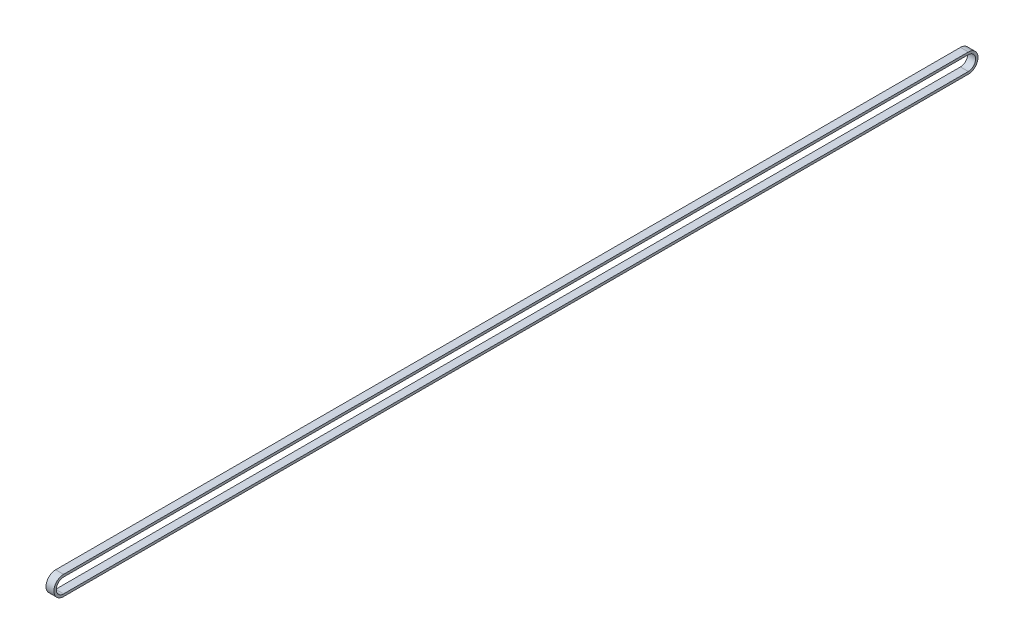
ISO-10303-21;
HEADER;
FILE_DESCRIPTION(('STEP AP214'),'2;1');
FILE_NAME('part.step','',(''),(''),'','','');
FILE_SCHEMA(('AUTOMOTIVE_DESIGN { 1 0 10303 214 1 1 1 1 }'));
ENDSEC;
DATA;
#1=APPLICATION_CONTEXT('core data for automotive mechanical design processes');
#2=APPLICATION_PROTOCOL_DEFINITION('international standard','automotive_design',2000,#1);
#3=PRODUCT_CONTEXT('',#1,'mechanical');
#4=PRODUCT('Part','Part','',(#3));
#5=PRODUCT_RELATED_PRODUCT_CATEGORY('part','',(#4));
#6=PRODUCT_DEFINITION_FORMATION('','',#4);
#7=PRODUCT_DEFINITION_CONTEXT('part definition',#1,'design');
#8=PRODUCT_DEFINITION('design','',#6,#7);
#9=PRODUCT_DEFINITION_SHAPE('','',#8);
#10=(LENGTH_UNIT() NAMED_UNIT(*) SI_UNIT(.MILLI.,.METRE.));
#11=(NAMED_UNIT(*) PLANE_ANGLE_UNIT() SI_UNIT($,.RADIAN.));
#12=(NAMED_UNIT(*) SI_UNIT($,.STERADIAN.) SOLID_ANGLE_UNIT());
#13=UNCERTAINTY_MEASURE_WITH_UNIT(LENGTH_MEASURE(1.E-05),#10,'distance_accuracy_value','');
#14=(GEOMETRIC_REPRESENTATION_CONTEXT(3) GLOBAL_UNCERTAINTY_ASSIGNED_CONTEXT((#13)) GLOBAL_UNIT_ASSIGNED_CONTEXT((#10,
#11,#12)) REPRESENTATION_CONTEXT('',''));
#15=CARTESIAN_POINT('',(0.,0.,0.));
#16=DIRECTION('',(0.,0.,1.));
#17=DIRECTION('',(1.,0.,0.));
#18=AXIS2_PLACEMENT_3D('',#15,#16,#17);
#19=CARTESIAN_POINT('',(10.,9.17000000000001,0.));
#20=DIRECTION('',(-1.,0.,0.));
#21=DIRECTION('',(0.,0.,1.));
#22=AXIS2_PLACEMENT_3D('',#19,#20,#21);
#23=PLANE('',#22);
#24=CARTESIAN_POINT('',(10.,9.17000000000001,0.));
#25=DIRECTION('',(1.,0.,0.));
#26=DIRECTION('',(0.,0.,1.));
#27=AXIS2_PLACEMENT_3D('',#24,#25,#26);
#28=CIRCLE('',#27,12.17);
#29=CARTESIAN_POINT('',(10.,21.34,0.));
#30=VERTEX_POINT('',#29);
#31=CARTESIAN_POINT('',(10.,-3.,0.));
#32=VERTEX_POINT('',#31);
#33=EDGE_CURVE('E157',#30,#32,#28,.T.);
#34=ORIENTED_EDGE('',*,*,#33,.T.);
#35=DIRECTION('',(0.,0.,-1.));
#36=VECTOR('',#35,1.);
#37=CARTESIAN_POINT('',(10.,-3.,0.));
#38=LINE('',#37,#36);
#39=CARTESIAN_POINT('',(10.,-3.,-1141.));
#40=VERTEX_POINT('',#39);
#41=EDGE_CURVE('E161',#32,#40,#38,.T.);
#42=ORIENTED_EDGE('',*,*,#41,.T.);
#43=CARTESIAN_POINT('',(10.,9.17000000000001,-1141.));
#44=DIRECTION('',(1.,0.,0.));
#45=DIRECTION('',(0.,0.,-1.));
#46=AXIS2_PLACEMENT_3D('',#43,#44,#45);
#47=CIRCLE('',#46,12.17);
#48=CARTESIAN_POINT('',(10.,21.34,-1141.));
#49=VERTEX_POINT('',#48);
#50=EDGE_CURVE('E165',#40,#49,#47,.T.);
#51=ORIENTED_EDGE('',*,*,#50,.T.);
#52=DIRECTION('',(0.,0.,1.));
#53=VECTOR('',#52,1.);
#54=CARTESIAN_POINT('',(10.,21.34,0.));
#55=LINE('',#54,#53);
#56=EDGE_CURVE('E168',#49,#30,#55,.T.);
#57=ORIENTED_EDGE('',*,*,#56,.T.);
#58=EDGE_LOOP('',(#34,#42,#51,#57));
#59=FACE_BOUND('',#58,.T.);
#60=CARTESIAN_POINT('',(10.,9.17000000000001,0.));
#61=DIRECTION('',(1.,0.,0.));
#62=DIRECTION('',(0.,0.,1.));
#63=AXIS2_PLACEMENT_3D('',#60,#61,#62);
#64=CIRCLE('',#63,9.17000000000001);
#65=CARTESIAN_POINT('',(10.,18.34,0.));
#66=VERTEX_POINT('',#65);
#67=CARTESIAN_POINT('',(10.,0.,0.));
#68=VERTEX_POINT('',#67);
#69=EDGE_CURVE('E109',#66,#68,#64,.T.);
#70=ORIENTED_EDGE('',*,*,#69,.F.);
#71=DIRECTION('',(0.,0.,1.));
#72=VECTOR('',#71,1.);
#73=CARTESIAN_POINT('',(10.,18.34,0.));
#74=LINE('',#73,#72);
#75=CARTESIAN_POINT('',(10.,18.34,-1141.));
#76=VERTEX_POINT('',#75);
#77=EDGE_CURVE('E135',#76,#66,#74,.T.);
#78=ORIENTED_EDGE('',*,*,#77,.F.);
#79=CARTESIAN_POINT('',(10.,9.17000000000001,-1141.));
#80=DIRECTION('',(1.,0.,0.));
#81=DIRECTION('',(0.,0.,-1.));
#82=AXIS2_PLACEMENT_3D('',#79,#80,#81);
#83=CIRCLE('',#82,9.17000000000001);
#84=CARTESIAN_POINT('',(10.,0.,-1141.));
#85=VERTEX_POINT('',#84);
#86=EDGE_CURVE('E131',#85,#76,#83,.T.);
#87=ORIENTED_EDGE('',*,*,#86,.F.);
#88=DIRECTION('',(0.,0.,-1.));
#89=VECTOR('',#88,1.);
#90=CARTESIAN_POINT('',(10.,0.,0.));
#91=LINE('',#90,#89);
#92=EDGE_CURVE('E118',#68,#85,#91,.T.);
#93=ORIENTED_EDGE('',*,*,#92,.F.);
#94=EDGE_LOOP('',(#70,#78,#87,#93));
#95=FACE_BOUND('',#94,.T.);
#96=ADVANCED_FACE('F43',(#59,#95),#23,.F.);
#97=CARTESIAN_POINT('',(0.,9.17000000000001,0.));
#98=DIRECTION('',(-1.,0.,0.));
#99=DIRECTION('',(0.,0.,1.));
#100=AXIS2_PLACEMENT_3D('',#97,#98,#99);
#101=PLANE('',#100);
#102=CARTESIAN_POINT('',(0.,9.17000000000001,0.));
#103=DIRECTION('',(1.,0.,0.));
#104=DIRECTION('',(0.,0.,1.));
#105=AXIS2_PLACEMENT_3D('',#102,#103,#104);
#106=CIRCLE('',#105,12.17);
#107=CARTESIAN_POINT('',(0.,21.34,0.));
#108=VERTEX_POINT('',#107);
#109=CARTESIAN_POINT('',(0.,-3.,0.));
#110=VERTEX_POINT('',#109);
#111=EDGE_CURVE('E127',#108,#110,#106,.T.);
#112=ORIENTED_EDGE('',*,*,#111,.F.);
#113=DIRECTION('',(0.,0.,1.));
#114=VECTOR('',#113,1.);
#115=CARTESIAN_POINT('',(0.,21.34,0.));
#116=LINE('',#115,#114);
#117=CARTESIAN_POINT('',(0.,21.34,-1141.));
#118=VERTEX_POINT('',#117);
#119=EDGE_CURVE('E162',#118,#108,#116,.T.);
#120=ORIENTED_EDGE('',*,*,#119,.F.);
#121=CARTESIAN_POINT('',(0.,9.17000000000001,-1141.));
#122=DIRECTION('',(1.,0.,0.));
#123=DIRECTION('',(0.,0.,-1.));
#124=AXIS2_PLACEMENT_3D('',#121,#122,#123);
#125=CIRCLE('',#124,12.17);
#126=CARTESIAN_POINT('',(0.,-3.,-1141.));
#127=VERTEX_POINT('',#126);
#128=EDGE_CURVE('E178',#127,#118,#125,.T.);
#129=ORIENTED_EDGE('',*,*,#128,.F.);
#130=DIRECTION('',(0.,0.,-1.));
#131=VECTOR('',#130,1.);
#132=CARTESIAN_POINT('',(0.,-3.,0.));
#133=LINE('',#132,#131);
#134=EDGE_CURVE('E175',#110,#127,#133,.T.);
#135=ORIENTED_EDGE('',*,*,#134,.F.);
#136=EDGE_LOOP('',(#112,#120,#129,#135));
#137=FACE_BOUND('',#136,.T.);
#138=DIRECTION('',(0.,0.,1.));
#139=VECTOR('',#138,1.);
#140=CARTESIAN_POINT('',(0.,18.34,0.));
#141=LINE('',#140,#139);
#142=CARTESIAN_POINT('',(0.,18.34,-1141.));
#143=VERTEX_POINT('',#142);
#144=CARTESIAN_POINT('',(0.,18.34,0.));
#145=VERTEX_POINT('',#144);
#146=EDGE_CURVE('E119',#143,#145,#141,.T.);
#147=ORIENTED_EDGE('',*,*,#146,.T.);
#148=CARTESIAN_POINT('',(0.,9.17000000000001,0.));
#149=DIRECTION('',(1.,0.,0.));
#150=DIRECTION('',(0.,0.,1.));
#151=AXIS2_PLACEMENT_3D('',#148,#149,#150);
#152=CIRCLE('',#151,9.17000000000001);
#153=CARTESIAN_POINT('',(0.,0.,0.));
#154=VERTEX_POINT('',#153);
#155=EDGE_CURVE('E67',#145,#154,#152,.T.);
#156=ORIENTED_EDGE('',*,*,#155,.T.);
#157=DIRECTION('',(0.,0.,-1.));
#158=VECTOR('',#157,1.);
#159=CARTESIAN_POINT('',(0.,0.,0.));
#160=LINE('',#159,#158);
#161=CARTESIAN_POINT('',(0.,0.,-1141.));
#162=VERTEX_POINT('',#161);
#163=EDGE_CURVE('E125',#154,#162,#160,.T.);
#164=ORIENTED_EDGE('',*,*,#163,.T.);
#165=CARTESIAN_POINT('',(0.,9.17000000000001,-1141.));
#166=DIRECTION('',(1.,0.,0.));
#167=DIRECTION('',(0.,0.,-1.));
#168=AXIS2_PLACEMENT_3D('',#165,#166,#167);
#169=CIRCLE('',#168,9.17000000000001);
#170=EDGE_CURVE('E144',#162,#143,#169,.T.);
#171=ORIENTED_EDGE('',*,*,#170,.T.);
#172=EDGE_LOOP('',(#147,#156,#164,#171));
#173=FACE_BOUND('',#172,.T.);
#174=ADVANCED_FACE('F201',(#137,#173),#101,.T.);
#175=CARTESIAN_POINT('',(10.,9.17000000000001,0.));
#176=DIRECTION('',(-1.,0.,0.));
#177=DIRECTION('',(0.,0.,1.));
#178=AXIS2_PLACEMENT_3D('',#175,#176,#177);
#179=CYLINDRICAL_SURFACE('',#178,12.17);
#180=ORIENTED_EDGE('',*,*,#111,.T.);
#181=DIRECTION('',(-1.,0.,0.));
#182=VECTOR('',#181,1.);
#183=CARTESIAN_POINT('',(10.,-3.,0.));
#184=LINE('',#183,#182);
#185=EDGE_CURVE('E11',#32,#110,#184,.T.);
#186=ORIENTED_EDGE('',*,*,#185,.F.);
#187=ORIENTED_EDGE('',*,*,#33,.F.);
#188=DIRECTION('',(-1.,0.,0.));
#189=VECTOR('',#188,1.);
#190=CARTESIAN_POINT('',(10.,21.34,0.));
#191=LINE('',#190,#189);
#192=EDGE_CURVE('E171',#30,#108,#191,.T.);
#193=ORIENTED_EDGE('',*,*,#192,.T.);
#194=EDGE_LOOP('',(#180,#186,#187,#193));
#195=FACE_BOUND('',#194,.T.);
#196=ADVANCED_FACE('F45',(#195),#179,.T.);
#197=CARTESIAN_POINT('',(10.,-3.,0.));
#198=DIRECTION('',(0.,1.,0.));
#199=DIRECTION('',(0.,0.,1.));
#200=AXIS2_PLACEMENT_3D('',#197,#198,#199);
#201=PLANE('',#200);
#202=ORIENTED_EDGE('',*,*,#134,.T.);
#203=DIRECTION('',(-1.,0.,0.));
#204=VECTOR('',#203,1.);
#205=CARTESIAN_POINT('',(10.,-3.,-1141.));
#206=LINE('',#205,#204);
#207=EDGE_CURVE('E52',#40,#127,#206,.T.);
#208=ORIENTED_EDGE('',*,*,#207,.F.);
#209=ORIENTED_EDGE('',*,*,#41,.F.);
#210=ORIENTED_EDGE('',*,*,#185,.T.);
#211=EDGE_LOOP('',(#202,#208,#209,#210));
#212=FACE_BOUND('',#211,.T.);
#213=ADVANCED_FACE('F211',(#212),#201,.F.);
#214=CARTESIAN_POINT('',(10.,9.17000000000001,-1141.));
#215=DIRECTION('',(-1.,0.,0.));
#216=DIRECTION('',(0.,0.,1.));
#217=AXIS2_PLACEMENT_3D('',#214,#215,#216);
#218=CYLINDRICAL_SURFACE('',#217,12.17);
#219=ORIENTED_EDGE('',*,*,#128,.T.);
#220=DIRECTION('',(-1.,0.,0.));
#221=VECTOR('',#220,1.);
#222=CARTESIAN_POINT('',(10.,21.34,-1141.));
#223=LINE('',#222,#221);
#224=EDGE_CURVE('E186',#49,#118,#223,.T.);
#225=ORIENTED_EDGE('',*,*,#224,.F.);
#226=ORIENTED_EDGE('',*,*,#50,.F.);
#227=ORIENTED_EDGE('',*,*,#207,.T.);
#228=EDGE_LOOP('',(#219,#225,#226,#227));
#229=FACE_BOUND('',#228,.T.);
#230=ADVANCED_FACE('F195',(#229),#218,.T.);
#231=CARTESIAN_POINT('',(10.,21.34,0.));
#232=DIRECTION('',(0.,-1.,0.));
#233=DIRECTION('',(0.,0.,-1.));
#234=AXIS2_PLACEMENT_3D('',#231,#232,#233);
#235=PLANE('',#234);
#236=ORIENTED_EDGE('',*,*,#119,.T.);
#237=ORIENTED_EDGE('',*,*,#192,.F.);
#238=ORIENTED_EDGE('',*,*,#56,.F.);
#239=ORIENTED_EDGE('',*,*,#224,.T.);
#240=EDGE_LOOP('',(#236,#237,#238,#239));
#241=FACE_BOUND('',#240,.T.);
#242=ADVANCED_FACE('F205',(#241),#235,.F.);
#243=CARTESIAN_POINT('',(10.,9.17000000000001,0.));
#244=DIRECTION('',(-1.,0.,0.));
#245=DIRECTION('',(0.,0.,1.));
#246=AXIS2_PLACEMENT_3D('',#243,#244,#245);
#247=CYLINDRICAL_SURFACE('',#246,9.17000000000001);
#248=ORIENTED_EDGE('',*,*,#155,.F.);
#249=DIRECTION('',(-1.,0.,0.));
#250=VECTOR('',#249,1.);
#251=CARTESIAN_POINT('',(10.,18.34,0.));
#252=LINE('',#251,#250);
#253=EDGE_CURVE('E113',#66,#145,#252,.T.);
#254=ORIENTED_EDGE('',*,*,#253,.F.);
#255=ORIENTED_EDGE('',*,*,#69,.T.);
#256=DIRECTION('',(-1.,0.,0.));
#257=VECTOR('',#256,1.);
#258=CARTESIAN_POINT('',(10.,0.,0.));
#259=LINE('',#258,#257);
#260=EDGE_CURVE('E112',#68,#154,#259,.T.);
#261=ORIENTED_EDGE('',*,*,#260,.T.);
#262=EDGE_LOOP('',(#248,#254,#255,#261));
#263=FACE_BOUND('',#262,.T.);
#264=ADVANCED_FACE('F111',(#263),#247,.F.);
#265=CARTESIAN_POINT('',(10.,0.,0.));
#266=DIRECTION('',(0.,1.,0.));
#267=DIRECTION('',(0.,0.,1.));
#268=AXIS2_PLACEMENT_3D('',#265,#266,#267);
#269=PLANE('',#268);
#270=ORIENTED_EDGE('',*,*,#163,.F.);
#271=ORIENTED_EDGE('',*,*,#260,.F.);
#272=ORIENTED_EDGE('',*,*,#92,.T.);
#273=DIRECTION('',(-1.,0.,0.));
#274=VECTOR('',#273,1.);
#275=CARTESIAN_POINT('',(10.,0.,-1141.));
#276=LINE('',#275,#274);
#277=EDGE_CURVE('E128',#85,#162,#276,.T.);
#278=ORIENTED_EDGE('',*,*,#277,.T.);
#279=EDGE_LOOP('',(#270,#271,#272,#278));
#280=FACE_BOUND('',#279,.T.);
#281=ADVANCED_FACE('F122',(#280),#269,.T.);
#282=CARTESIAN_POINT('',(10.,9.17000000000001,-1141.));
#283=DIRECTION('',(-1.,0.,0.));
#284=DIRECTION('',(0.,0.,1.));
#285=AXIS2_PLACEMENT_3D('',#282,#283,#284);
#286=CYLINDRICAL_SURFACE('',#285,9.17000000000001);
#287=ORIENTED_EDGE('',*,*,#170,.F.);
#288=ORIENTED_EDGE('',*,*,#277,.F.);
#289=ORIENTED_EDGE('',*,*,#86,.T.);
#290=DIRECTION('',(-1.,0.,0.));
#291=VECTOR('',#290,1.);
#292=CARTESIAN_POINT('',(10.,18.34,-1141.));
#293=LINE('',#292,#291);
#294=EDGE_CURVE('E59',#76,#143,#293,.T.);
#295=ORIENTED_EDGE('',*,*,#294,.T.);
#296=EDGE_LOOP('',(#287,#288,#289,#295));
#297=FACE_BOUND('',#296,.T.);
#298=ADVANCED_FACE('F234',(#297),#286,.F.);
#299=CARTESIAN_POINT('',(10.,18.34,0.));
#300=DIRECTION('',(0.,-1.,0.));
#301=DIRECTION('',(0.,0.,-1.));
#302=AXIS2_PLACEMENT_3D('',#299,#300,#301);
#303=PLANE('',#302);
#304=ORIENTED_EDGE('',*,*,#146,.F.);
#305=ORIENTED_EDGE('',*,*,#294,.F.);
#306=ORIENTED_EDGE('',*,*,#77,.T.);
#307=ORIENTED_EDGE('',*,*,#253,.T.);
#308=EDGE_LOOP('',(#304,#305,#306,#307));
#309=FACE_BOUND('',#308,.T.);
#310=ADVANCED_FACE('F238',(#309),#303,.T.);
#311=CLOSED_SHELL('',(#96,#174,#196,#213,#230,#242,#264,#281,#298,#310));
#312=MANIFOLD_SOLID_BREP('B2',#311);
#313=ADVANCED_BREP_SHAPE_REPRESENTATION('',(#18,#312),#14);
#314=SHAPE_DEFINITION_REPRESENTATION(#9,#313);
ENDSEC;
END-ISO-10303-21;
